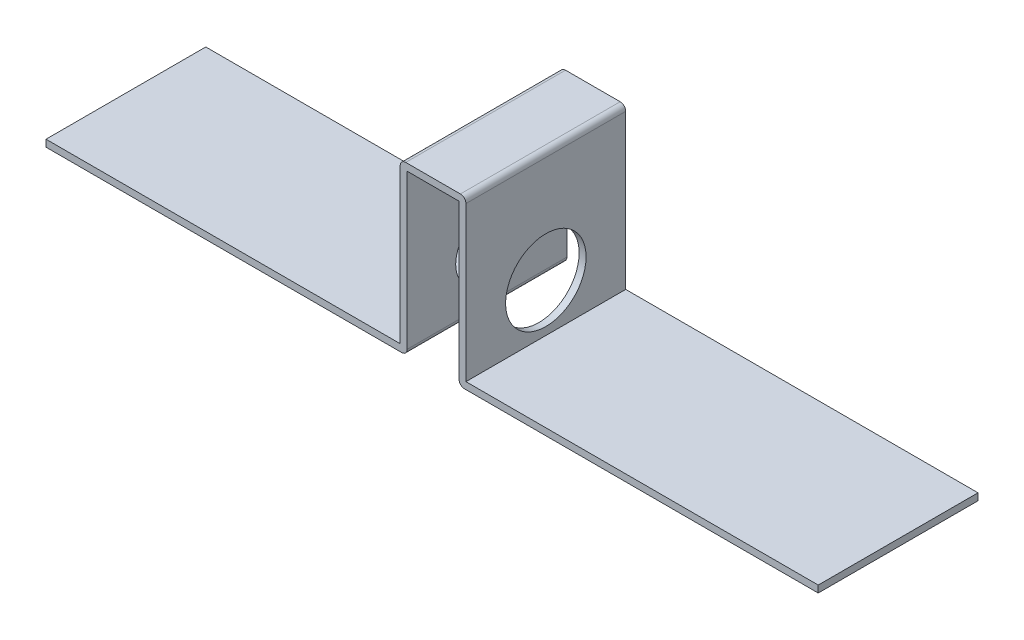
ISO-10303-21;
HEADER;
FILE_DESCRIPTION(('STEP AP214'),'2;1');
FILE_NAME('part.step','',(''),(''),'','','');
FILE_SCHEMA(('AUTOMOTIVE_DESIGN { 1 0 10303 214 1 1 1 1 }'));
ENDSEC;
DATA;
#1=APPLICATION_CONTEXT('core data for automotive mechanical design processes');
#2=APPLICATION_PROTOCOL_DEFINITION('international standard','automotive_design',2000,#1);
#3=PRODUCT_CONTEXT('',#1,'mechanical');
#4=PRODUCT('Part','Part','',(#3));
#5=PRODUCT_RELATED_PRODUCT_CATEGORY('part','',(#4));
#6=PRODUCT_DEFINITION_FORMATION('','',#4);
#7=PRODUCT_DEFINITION_CONTEXT('part definition',#1,'design');
#8=PRODUCT_DEFINITION('design','',#6,#7);
#9=PRODUCT_DEFINITION_SHAPE('','',#8);
#10=(LENGTH_UNIT() NAMED_UNIT(*) SI_UNIT(.MILLI.,.METRE.));
#11=(NAMED_UNIT(*) PLANE_ANGLE_UNIT() SI_UNIT($,.RADIAN.));
#12=(NAMED_UNIT(*) SI_UNIT($,.STERADIAN.) SOLID_ANGLE_UNIT());
#13=UNCERTAINTY_MEASURE_WITH_UNIT(LENGTH_MEASURE(1.E-05),#10,'distance_accuracy_value','');
#14=(GEOMETRIC_REPRESENTATION_CONTEXT(3) GLOBAL_UNCERTAINTY_ASSIGNED_CONTEXT((#13)) GLOBAL_UNIT_ASSIGNED_CONTEXT((#10,
#11,#12)) REPRESENTATION_CONTEXT('',''));
#15=CARTESIAN_POINT('',(0.,0.,0.));
#16=DIRECTION('',(0.,0.,1.));
#17=DIRECTION('',(1.,0.,0.));
#18=AXIS2_PLACEMENT_3D('',#15,#16,#17);
#19=CARTESIAN_POINT('',(0.,3.175,73.152));
#20=DIRECTION('',(1.,0.,0.));
#21=DIRECTION('',(0.,0.,-1.));
#22=AXIS2_PLACEMENT_3D('',#19,#20,#21);
#23=PLANE('',#22);
#24=DIRECTION('',(0.,-1.,0.));
#25=VECTOR('',#24,1.);
#26=CARTESIAN_POINT('',(0.,3.175,0.));
#27=LINE('',#26,#25);
#28=CARTESIAN_POINT('',(0.,3.175,0.));
#29=VERTEX_POINT('',#28);
#30=CARTESIAN_POINT('',(0.,0.,0.));
#31=VERTEX_POINT('',#30);
#32=EDGE_CURVE('E174',#29,#31,#27,.T.);
#33=ORIENTED_EDGE('',*,*,#32,.T.);
#34=DIRECTION('',(0.,0.,-1.));
#35=VECTOR('',#34,1.);
#36=CARTESIAN_POINT('',(0.,0.,73.152));
#37=LINE('',#36,#35);
#38=CARTESIAN_POINT('',(0.,0.,73.152));
#39=VERTEX_POINT('',#38);
#40=EDGE_CURVE('E155',#39,#31,#37,.T.);
#41=ORIENTED_EDGE('',*,*,#40,.F.);
#42=DIRECTION('',(0.,-1.,0.));
#43=VECTOR('',#42,1.);
#44=CARTESIAN_POINT('',(0.,3.175,73.152));
#45=LINE('',#44,#43);
#46=CARTESIAN_POINT('',(0.,3.175,73.152));
#47=VERTEX_POINT('',#46);
#48=EDGE_CURVE('E161',#47,#39,#45,.T.);
#49=ORIENTED_EDGE('',*,*,#48,.F.);
#50=DIRECTION('',(0.,0.,-1.));
#51=VECTOR('',#50,1.);
#52=CARTESIAN_POINT('',(0.,3.175,73.152));
#53=LINE('',#52,#51);
#54=EDGE_CURVE('E243',#47,#29,#53,.T.);
#55=ORIENTED_EDGE('',*,*,#54,.T.);
#56=EDGE_LOOP('',(#33,#41,#49,#55));
#57=FACE_BOUND('',#56,.T.);
#58=ADVANCED_FACE('F35',(#57),#23,.F.);
#59=CARTESIAN_POINT('',(0.,0.,73.152));
#60=DIRECTION('',(0.,1.,0.));
#61=DIRECTION('',(0.,0.,1.));
#62=AXIS2_PLACEMENT_3D('',#59,#60,#61);
#63=PLANE('',#62);
#64=DIRECTION('',(1.,0.,0.));
#65=VECTOR('',#64,1.);
#66=CARTESIAN_POINT('',(0.,0.,0.));
#67=LINE('',#66,#65);
#68=CARTESIAN_POINT('',(162.814,0.,0.));
#69=VERTEX_POINT('',#68);
#70=EDGE_CURVE('E309',#31,#69,#67,.T.);
#71=ORIENTED_EDGE('',*,*,#70,.T.);
#72=DIRECTION('',(0.,0.,-1.));
#73=VECTOR('',#72,1.);
#74=CARTESIAN_POINT('',(162.814,0.,73.152));
#75=LINE('',#74,#73);
#76=CARTESIAN_POINT('',(162.814,0.,73.152));
#77=VERTEX_POINT('',#76);
#78=EDGE_CURVE('E158',#69,#77,#75,.F.);
#79=ORIENTED_EDGE('',*,*,#78,.T.);
#80=DIRECTION('',(1.,0.,0.));
#81=VECTOR('',#80,1.);
#82=CARTESIAN_POINT('',(0.,0.,73.152));
#83=LINE('',#82,#81);
#84=EDGE_CURVE('E150',#39,#77,#83,.T.);
#85=ORIENTED_EDGE('',*,*,#84,.F.);
#86=ORIENTED_EDGE('',*,*,#40,.T.);
#87=EDGE_LOOP('',(#71,#79,#85,#86));
#88=FACE_BOUND('',#87,.T.);
#89=ADVANCED_FACE('F153',(#88),#63,.F.);
#90=CARTESIAN_POINT('',(165.354,0.,73.152));
#91=DIRECTION('',(-1.,0.,0.));
#92=DIRECTION('',(0.,0.,1.));
#93=AXIS2_PLACEMENT_3D('',#90,#91,#92);
#94=PLANE('',#93);
#95=CARTESIAN_POINT('',(165.354,25.146,36.576));
#96=DIRECTION('',(-1.,0.,0.));
#97=DIRECTION('',(0.,0.,1.));
#98=AXIS2_PLACEMENT_3D('',#95,#96,#97);
#99=CIRCLE('',#98,14.351);
#100=CARTESIAN_POINT('',(165.354,25.146,50.927));
#101=VERTEX_POINT('',#100);
#102=EDGE_CURVE('E310',#101,#101,#99,.T.);
#103=ORIENTED_EDGE('',*,*,#102,.T.);
#104=EDGE_LOOP('',(#103));
#105=FACE_BOUND('',#104,.T.);
#106=DIRECTION('',(0.,1.,0.));
#107=VECTOR('',#106,1.);
#108=CARTESIAN_POINT('',(165.354,0.,73.152));
#109=LINE('',#108,#107);
#110=CARTESIAN_POINT('',(165.354,2.54,73.152));
#111=VERTEX_POINT('',#110);
#112=CARTESIAN_POINT('',(165.354,73.152,73.152));
#113=VERTEX_POINT('',#112);
#114=EDGE_CURVE('E160',#111,#113,#109,.T.);
#115=ORIENTED_EDGE('',*,*,#114,.F.);
#116=DIRECTION('',(0.,0.,-1.));
#117=VECTOR('',#116,1.);
#118=CARTESIAN_POINT('',(165.354,2.54,73.152));
#119=LINE('',#118,#117);
#120=CARTESIAN_POINT('',(165.354,2.54,0.));
#121=VERTEX_POINT('',#120);
#122=EDGE_CURVE('E202',#111,#121,#119,.T.);
#123=ORIENTED_EDGE('',*,*,#122,.T.);
#124=DIRECTION('',(0.,1.,0.));
#125=VECTOR('',#124,1.);
#126=CARTESIAN_POINT('',(165.354,0.,0.));
#127=LINE('',#126,#125);
#128=CARTESIAN_POINT('',(165.354,73.152,0.));
#129=VERTEX_POINT('',#128);
#130=EDGE_CURVE('E274',#121,#129,#127,.T.);
#131=ORIENTED_EDGE('',*,*,#130,.T.);
#132=DIRECTION('',(0.,0.,-1.));
#133=VECTOR('',#132,1.);
#134=CARTESIAN_POINT('',(165.354,73.152,73.152));
#135=LINE('',#134,#133);
#136=EDGE_CURVE('E176',#113,#129,#135,.T.);
#137=ORIENTED_EDGE('',*,*,#136,.F.);
#138=EDGE_LOOP('',(#115,#123,#131,#137));
#139=FACE_BOUND('',#138,.T.);
#140=ADVANCED_FACE('F314',(#105,#139),#94,.F.);
#141=CARTESIAN_POINT('',(165.354,73.152,73.152));
#142=DIRECTION('',(0.,1.,0.));
#143=DIRECTION('',(0.,0.,1.));
#144=AXIS2_PLACEMENT_3D('',#141,#142,#143);
#145=PLANE('',#144);
#146=DIRECTION('',(1.,0.,0.));
#147=VECTOR('',#146,1.);
#148=CARTESIAN_POINT('',(165.354,73.152,0.));
#149=LINE('',#148,#147);
#150=CARTESIAN_POINT('',(189.103,73.152,0.));
#151=VERTEX_POINT('',#150);
#152=EDGE_CURVE('E269',#129,#151,#149,.T.);
#153=ORIENTED_EDGE('',*,*,#152,.T.);
#154=DIRECTION('',(0.,0.,-1.));
#155=VECTOR('',#154,1.);
#156=CARTESIAN_POINT('',(189.103,73.152,73.152));
#157=LINE('',#156,#155);
#158=CARTESIAN_POINT('',(189.103,73.152,73.152));
#159=VERTEX_POINT('',#158);
#160=EDGE_CURVE('E182',#159,#151,#157,.T.);
#161=ORIENTED_EDGE('',*,*,#160,.F.);
#162=DIRECTION('',(1.,0.,0.));
#163=VECTOR('',#162,1.);
#164=CARTESIAN_POINT('',(165.354,73.152,73.152));
#165=LINE('',#164,#163);
#166=EDGE_CURVE('E296',#113,#159,#165,.T.);
#167=ORIENTED_EDGE('',*,*,#166,.F.);
#168=ORIENTED_EDGE('',*,*,#136,.T.);
#169=EDGE_LOOP('',(#153,#161,#167,#168));
#170=FACE_BOUND('',#169,.T.);
#171=ADVANCED_FACE('F316',(#170),#145,.F.);
#172=CARTESIAN_POINT('',(189.103,73.152,73.152));
#173=DIRECTION('',(1.,0.,0.));
#174=DIRECTION('',(0.,1.,0.));
#175=AXIS2_PLACEMENT_3D('',#172,#173,#174);
#176=PLANE('',#175);
#177=CARTESIAN_POINT('',(189.103,25.146,36.576));
#178=DIRECTION('',(1.,0.,0.));
#179=DIRECTION('',(0.,1.,0.));
#180=AXIS2_PLACEMENT_3D('',#177,#178,#179);
#181=CIRCLE('',#180,18.415);
#182=CARTESIAN_POINT('',(189.103,43.561,36.576));
#183=VERTEX_POINT('',#182);
#184=EDGE_CURVE('E500',#183,#183,#181,.T.);
#185=ORIENTED_EDGE('',*,*,#184,.T.);
#186=EDGE_LOOP('',(#185));
#187=FACE_BOUND('',#186,.T.);
#188=DIRECTION('',(0.,-1.,0.));
#189=VECTOR('',#188,1.);
#190=CARTESIAN_POINT('',(189.103,73.152,0.));
#191=LINE('',#190,#189);
#192=CARTESIAN_POINT('',(189.103,2.54,0.));
#193=VERTEX_POINT('',#192);
#194=EDGE_CURVE('E262',#151,#193,#191,.T.);
#195=ORIENTED_EDGE('',*,*,#194,.T.);
#196=DIRECTION('',(0.,0.,-1.));
#197=VECTOR('',#196,1.);
#198=CARTESIAN_POINT('',(189.103,2.54,73.152));
#199=LINE('',#198,#197);
#200=CARTESIAN_POINT('',(189.103,2.54,73.152));
#201=VERTEX_POINT('',#200);
#202=EDGE_CURVE('E193',#193,#201,#199,.F.);
#203=ORIENTED_EDGE('',*,*,#202,.T.);
#204=DIRECTION('',(0.,-1.,0.));
#205=VECTOR('',#204,1.);
#206=CARTESIAN_POINT('',(189.103,73.152,73.152));
#207=LINE('',#206,#205);
#208=EDGE_CURVE('E264',#159,#201,#207,.T.);
#209=ORIENTED_EDGE('',*,*,#208,.F.);
#210=ORIENTED_EDGE('',*,*,#160,.T.);
#211=EDGE_LOOP('',(#195,#203,#209,#210));
#212=FACE_BOUND('',#211,.T.);
#213=ADVANCED_FACE('F261',(#187,#212),#176,.F.);
#214=CARTESIAN_POINT('',(189.103,0.,73.152));
#215=DIRECTION('',(0.,1.,0.));
#216=DIRECTION('',(-1.,0.,0.));
#217=AXIS2_PLACEMENT_3D('',#214,#215,#216);
#218=PLANE('',#217);
#219=DIRECTION('',(1.,0.,0.));
#220=VECTOR('',#219,1.);
#221=CARTESIAN_POINT('',(189.103,0.,73.152));
#222=LINE('',#221,#220);
#223=CARTESIAN_POINT('',(191.643,0.,73.152));
#224=VERTEX_POINT('',#223);
#225=CARTESIAN_POINT('',(353.568,0.,73.152));
#226=VERTEX_POINT('',#225);
#227=EDGE_CURVE('E291',#224,#226,#222,.T.);
#228=ORIENTED_EDGE('',*,*,#227,.F.);
#229=DIRECTION('',(0.,0.,-1.));
#230=VECTOR('',#229,1.);
#231=CARTESIAN_POINT('',(191.643,0.,73.152));
#232=LINE('',#231,#230);
#233=CARTESIAN_POINT('',(191.643,0.,0.));
#234=VERTEX_POINT('',#233);
#235=EDGE_CURVE('E175',#224,#234,#232,.T.);
#236=ORIENTED_EDGE('',*,*,#235,.T.);
#237=DIRECTION('',(1.,0.,0.));
#238=VECTOR('',#237,1.);
#239=CARTESIAN_POINT('',(189.103,0.,0.));
#240=LINE('',#239,#238);
#241=CARTESIAN_POINT('',(353.568,0.,0.));
#242=VERTEX_POINT('',#241);
#243=EDGE_CURVE('E270',#234,#242,#240,.T.);
#244=ORIENTED_EDGE('',*,*,#243,.T.);
#245=DIRECTION('',(0.,0.,-1.));
#246=VECTOR('',#245,1.);
#247=CARTESIAN_POINT('',(353.568,0.,73.152));
#248=LINE('',#247,#246);
#249=EDGE_CURVE('E253',#226,#242,#248,.T.);
#250=ORIENTED_EDGE('',*,*,#249,.F.);
#251=EDGE_LOOP('',(#228,#236,#244,#250));
#252=FACE_BOUND('',#251,.T.);
#253=ADVANCED_FACE('F290',(#252),#218,.F.);
#254=CARTESIAN_POINT('',(353.568,3.175,73.152));
#255=DIRECTION('',(-1.,0.,0.));
#256=DIRECTION('',(0.,0.,1.));
#257=AXIS2_PLACEMENT_3D('',#254,#255,#256);
#258=PLANE('',#257);
#259=DIRECTION('',(0.,1.,0.));
#260=VECTOR('',#259,1.);
#261=CARTESIAN_POINT('',(353.568,3.175,0.));
#262=LINE('',#261,#260);
#263=CARTESIAN_POINT('',(353.568,3.175,0.));
#264=VERTEX_POINT('',#263);
#265=EDGE_CURVE('E272',#242,#264,#262,.T.);
#266=ORIENTED_EDGE('',*,*,#265,.T.);
#267=DIRECTION('',(0.,0.,-1.));
#268=VECTOR('',#267,1.);
#269=CARTESIAN_POINT('',(353.568,3.175,73.152));
#270=LINE('',#269,#268);
#271=CARTESIAN_POINT('',(353.568,3.175,73.152));
#272=VERTEX_POINT('',#271);
#273=EDGE_CURVE('E250',#272,#264,#270,.T.);
#274=ORIENTED_EDGE('',*,*,#273,.F.);
#275=DIRECTION('',(0.,1.,0.));
#276=VECTOR('',#275,1.);
#277=CARTESIAN_POINT('',(353.568,3.175,73.152));
#278=LINE('',#277,#276);
#279=EDGE_CURVE('E287',#226,#272,#278,.T.);
#280=ORIENTED_EDGE('',*,*,#279,.F.);
#281=ORIENTED_EDGE('',*,*,#249,.T.);
#282=EDGE_LOOP('',(#266,#274,#280,#281));
#283=FACE_BOUND('',#282,.T.);
#284=ADVANCED_FACE('F284',(#283),#258,.F.);
#285=CARTESIAN_POINT('',(192.278,3.175,73.152));
#286=DIRECTION('',(0.,-1.,0.));
#287=DIRECTION('',(0.,0.,-1.));
#288=AXIS2_PLACEMENT_3D('',#285,#286,#287);
#289=PLANE('',#288);
#290=DIRECTION('',(-1.,0.,0.));
#291=VECTOR('',#290,1.);
#292=CARTESIAN_POINT('',(192.278,3.175,0.));
#293=LINE('',#292,#291);
#294=CARTESIAN_POINT('',(192.278,3.175,0.));
#295=VERTEX_POINT('',#294);
#296=EDGE_CURVE('E238',#264,#295,#293,.T.);
#297=ORIENTED_EDGE('',*,*,#296,.T.);
#298=DIRECTION('',(0.,0.,-1.));
#299=VECTOR('',#298,1.);
#300=CARTESIAN_POINT('',(192.278,3.175,73.152));
#301=LINE('',#300,#299);
#302=CARTESIAN_POINT('',(192.278,3.175,73.152));
#303=VERTEX_POINT('',#302);
#304=EDGE_CURVE('E248',#303,#295,#301,.T.);
#305=ORIENTED_EDGE('',*,*,#304,.F.);
#306=DIRECTION('',(-1.,0.,0.));
#307=VECTOR('',#306,1.);
#308=CARTESIAN_POINT('',(192.278,3.175,73.152));
#309=LINE('',#308,#307);
#310=EDGE_CURVE('E222',#272,#303,#309,.T.);
#311=ORIENTED_EDGE('',*,*,#310,.F.);
#312=ORIENTED_EDGE('',*,*,#273,.T.);
#313=EDGE_LOOP('',(#297,#305,#311,#312));
#314=FACE_BOUND('',#313,.T.);
#315=ADVANCED_FACE('F280',(#314),#289,.F.);
#316=CARTESIAN_POINT('',(192.278,76.327,73.152));
#317=DIRECTION('',(-1.,0.,0.));
#318=DIRECTION('',(0.,0.,1.));
#319=AXIS2_PLACEMENT_3D('',#316,#317,#318);
#320=PLANE('',#319);
#321=CARTESIAN_POINT('',(192.278,25.146,36.576));
#322=DIRECTION('',(1.,0.,0.));
#323=DIRECTION('',(0.,0.,-1.));
#324=AXIS2_PLACEMENT_3D('',#321,#322,#323);
#325=CIRCLE('',#324,18.415);
#326=CARTESIAN_POINT('',(192.278,25.146,18.161));
#327=VERTEX_POINT('',#326);
#328=EDGE_CURVE('E505',#327,#327,#325,.T.);
#329=ORIENTED_EDGE('',*,*,#328,.F.);
#330=EDGE_LOOP('',(#329));
#331=FACE_BOUND('',#330,.T.);
#332=DIRECTION('',(0.,1.,0.));
#333=VECTOR('',#332,1.);
#334=CARTESIAN_POINT('',(192.278,76.327,0.));
#335=LINE('',#334,#333);
#336=CARTESIAN_POINT('',(192.278,73.787,0.));
#337=VERTEX_POINT('',#336);
#338=EDGE_CURVE('E218',#295,#337,#335,.T.);
#339=ORIENTED_EDGE('',*,*,#338,.T.);
#340=DIRECTION('',(0.,0.,-1.));
#341=VECTOR('',#340,1.);
#342=CARTESIAN_POINT('',(192.278,73.787,73.152));
#343=LINE('',#342,#341);
#344=CARTESIAN_POINT('',(192.278,73.787,73.152));
#345=VERTEX_POINT('',#344);
#346=EDGE_CURVE('E43',#337,#345,#343,.F.);
#347=ORIENTED_EDGE('',*,*,#346,.T.);
#348=DIRECTION('',(0.,1.,0.));
#349=VECTOR('',#348,1.);
#350=CARTESIAN_POINT('',(192.278,76.327,73.152));
#351=LINE('',#350,#349);
#352=EDGE_CURVE('E216',#303,#345,#351,.T.);
#353=ORIENTED_EDGE('',*,*,#352,.F.);
#354=ORIENTED_EDGE('',*,*,#304,.T.);
#355=EDGE_LOOP('',(#339,#347,#353,#354));
#356=FACE_BOUND('',#355,.T.);
#357=ADVANCED_FACE('F214',(#331,#356),#320,.F.);
#358=CARTESIAN_POINT('',(162.179,76.327,73.152));
#359=DIRECTION('',(0.,-1.,0.));
#360=DIRECTION('',(0.,0.,-1.));
#361=AXIS2_PLACEMENT_3D('',#358,#359,#360);
#362=PLANE('',#361);
#363=DIRECTION('',(-1.,0.,0.));
#364=VECTOR('',#363,1.);
#365=CARTESIAN_POINT('',(162.179,76.327,73.152));
#366=LINE('',#365,#364);
#367=CARTESIAN_POINT('',(189.738,76.327,73.152));
#368=VERTEX_POINT('',#367);
#369=CARTESIAN_POINT('',(164.719,76.327,73.152));
#370=VERTEX_POINT('',#369);
#371=EDGE_CURVE('E224',#368,#370,#366,.T.);
#372=ORIENTED_EDGE('',*,*,#371,.F.);
#373=DIRECTION('',(0.,0.,-1.));
#374=VECTOR('',#373,1.);
#375=CARTESIAN_POINT('',(189.738,76.327,73.152));
#376=LINE('',#375,#374);
#377=CARTESIAN_POINT('',(189.738,76.327,0.));
#378=VERTEX_POINT('',#377);
#379=EDGE_CURVE('E207',#368,#378,#376,.T.);
#380=ORIENTED_EDGE('',*,*,#379,.T.);
#381=DIRECTION('',(-1.,0.,0.));
#382=VECTOR('',#381,1.);
#383=CARTESIAN_POINT('',(162.179,76.327,0.));
#384=LINE('',#383,#382);
#385=CARTESIAN_POINT('',(164.719,76.327,0.));
#386=VERTEX_POINT('',#385);
#387=EDGE_CURVE('E230',#378,#386,#384,.T.);
#388=ORIENTED_EDGE('',*,*,#387,.T.);
#389=DIRECTION('',(0.,0.,-1.));
#390=VECTOR('',#389,1.);
#391=CARTESIAN_POINT('',(164.719,76.327,73.152));
#392=LINE('',#391,#390);
#393=EDGE_CURVE('E58',#386,#370,#392,.F.);
#394=ORIENTED_EDGE('',*,*,#393,.T.);
#395=EDGE_LOOP('',(#372,#380,#388,#394));
#396=FACE_BOUND('',#395,.T.);
#397=ADVANCED_FACE('F229',(#396),#362,.F.);
#398=CARTESIAN_POINT('',(162.179,3.175,73.152));
#399=DIRECTION('',(1.,0.,0.));
#400=DIRECTION('',(0.,0.,-1.));
#401=AXIS2_PLACEMENT_3D('',#398,#399,#400);
#402=PLANE('',#401);
#403=CARTESIAN_POINT('',(162.179,25.146,36.576));
#404=DIRECTION('',(-1.,0.,0.));
#405=DIRECTION('',(0.,0.,1.));
#406=AXIS2_PLACEMENT_3D('',#403,#404,#405);
#407=CIRCLE('',#406,14.351);
#408=CARTESIAN_POINT('',(162.179,25.146,50.927));
#409=VERTEX_POINT('',#408);
#410=EDGE_CURVE('E496',#409,#409,#407,.T.);
#411=ORIENTED_EDGE('',*,*,#410,.F.);
#412=EDGE_LOOP('',(#411));
#413=FACE_BOUND('',#412,.T.);
#414=DIRECTION('',(0.,-1.,0.));
#415=VECTOR('',#414,1.);
#416=CARTESIAN_POINT('',(162.179,3.175,73.152));
#417=LINE('',#416,#415);
#418=CARTESIAN_POINT('',(162.179,73.787,73.152));
#419=VERTEX_POINT('',#418);
#420=CARTESIAN_POINT('',(162.179,3.175,73.152));
#421=VERTEX_POINT('',#420);
#422=EDGE_CURVE('E305',#419,#421,#417,.T.);
#423=ORIENTED_EDGE('',*,*,#422,.F.);
#424=DIRECTION('',(0.,0.,-1.));
#425=VECTOR('',#424,1.);
#426=CARTESIAN_POINT('',(162.179,73.787,73.152));
#427=LINE('',#426,#425);
#428=CARTESIAN_POINT('',(162.179,73.787,0.));
#429=VERTEX_POINT('',#428);
#430=EDGE_CURVE('E11',#419,#429,#427,.T.);
#431=ORIENTED_EDGE('',*,*,#430,.T.);
#432=DIRECTION('',(0.,-1.,0.));
#433=VECTOR('',#432,1.);
#434=CARTESIAN_POINT('',(162.179,3.175,0.));
#435=LINE('',#434,#433);
#436=CARTESIAN_POINT('',(162.179,3.175,0.));
#437=VERTEX_POINT('',#436);
#438=EDGE_CURVE('E235',#429,#437,#435,.T.);
#439=ORIENTED_EDGE('',*,*,#438,.T.);
#440=DIRECTION('',(0.,0.,-1.));
#441=VECTOR('',#440,1.);
#442=CARTESIAN_POINT('',(162.179,3.175,73.152));
#443=LINE('',#442,#441);
#444=EDGE_CURVE('E245',#421,#437,#443,.T.);
#445=ORIENTED_EDGE('',*,*,#444,.F.);
#446=EDGE_LOOP('',(#423,#431,#439,#445));
#447=FACE_BOUND('',#446,.T.);
#448=ADVANCED_FACE('F352',(#413,#447),#402,.F.);
#449=CARTESIAN_POINT('',(0.,3.175,73.152));
#450=DIRECTION('',(0.,-1.,0.));
#451=DIRECTION('',(0.,0.,-1.));
#452=AXIS2_PLACEMENT_3D('',#449,#450,#451);
#453=PLANE('',#452);
#454=DIRECTION('',(-1.,0.,0.));
#455=VECTOR('',#454,1.);
#456=CARTESIAN_POINT('',(0.,3.175,0.));
#457=LINE('',#456,#455);
#458=EDGE_CURVE('E171',#437,#29,#457,.T.);
#459=ORIENTED_EDGE('',*,*,#458,.T.);
#460=ORIENTED_EDGE('',*,*,#54,.F.);
#461=DIRECTION('',(-1.,0.,0.));
#462=VECTOR('',#461,1.);
#463=CARTESIAN_POINT('',(0.,3.175,73.152));
#464=LINE('',#463,#462);
#465=EDGE_CURVE('E167',#421,#47,#464,.T.);
#466=ORIENTED_EDGE('',*,*,#465,.F.);
#467=ORIENTED_EDGE('',*,*,#444,.T.);
#468=EDGE_LOOP('',(#459,#460,#466,#467));
#469=FACE_BOUND('',#468,.T.);
#470=ADVANCED_FACE('F356',(#469),#453,.F.);
#471=CARTESIAN_POINT('',(0.,0.,73.152));
#472=DIRECTION('',(0.,0.,1.));
#473=DIRECTION('',(1.,0.,0.));
#474=AXIS2_PLACEMENT_3D('',#471,#472,#473);
#475=PLANE('',#474);
#476=ORIENTED_EDGE('',*,*,#208,.T.);
#477=CARTESIAN_POINT('',(191.643,2.54,73.152));
#478=DIRECTION('',(0.,0.,1.));
#479=DIRECTION('',(1.,0.,0.));
#480=AXIS2_PLACEMENT_3D('',#477,#478,#479);
#481=CIRCLE('',#480,2.54);
#482=EDGE_CURVE('E200',#201,#224,#481,.T.);
#483=ORIENTED_EDGE('',*,*,#482,.T.);
#484=ORIENTED_EDGE('',*,*,#227,.T.);
#485=ORIENTED_EDGE('',*,*,#279,.T.);
#486=ORIENTED_EDGE('',*,*,#310,.T.);
#487=ORIENTED_EDGE('',*,*,#352,.T.);
#488=CARTESIAN_POINT('',(189.738,73.787,73.152));
#489=DIRECTION('',(0.,0.,1.));
#490=DIRECTION('',(1.,0.,0.));
#491=AXIS2_PLACEMENT_3D('',#488,#489,#490);
#492=CIRCLE('',#491,2.54);
#493=EDGE_CURVE('E196',#345,#368,#492,.T.);
#494=ORIENTED_EDGE('',*,*,#493,.T.);
#495=ORIENTED_EDGE('',*,*,#371,.T.);
#496=CARTESIAN_POINT('',(164.719,73.787,73.152));
#497=DIRECTION('',(0.,0.,1.));
#498=DIRECTION('',(1.,0.,0.));
#499=AXIS2_PLACEMENT_3D('',#496,#497,#498);
#500=CIRCLE('',#499,2.54);
#501=EDGE_CURVE('E50',#370,#419,#500,.T.);
#502=ORIENTED_EDGE('',*,*,#501,.T.);
#503=ORIENTED_EDGE('',*,*,#422,.T.);
#504=ORIENTED_EDGE('',*,*,#465,.T.);
#505=ORIENTED_EDGE('',*,*,#48,.T.);
#506=ORIENTED_EDGE('',*,*,#84,.T.);
#507=CARTESIAN_POINT('',(162.814,2.54,73.152));
#508=DIRECTION('',(0.,0.,1.));
#509=DIRECTION('',(1.,0.,0.));
#510=AXIS2_PLACEMENT_3D('',#507,#508,#509);
#511=CIRCLE('',#510,2.54);
#512=EDGE_CURVE('E198',#77,#111,#511,.T.);
#513=ORIENTED_EDGE('',*,*,#512,.T.);
#514=ORIENTED_EDGE('',*,*,#114,.T.);
#515=ORIENTED_EDGE('',*,*,#166,.T.);
#516=EDGE_LOOP('',(#476,#483,#484,#485,#486,#487,#494,#495,#502,#503,#504,#505,#506,#513,#514,#515));
#517=FACE_BOUND('',#516,.T.);
#518=ADVANCED_FACE('F165',(#517),#475,.T.);
#519=CARTESIAN_POINT('',(0.,0.,0.));
#520=DIRECTION('',(0.,0.,1.));
#521=DIRECTION('',(1.,0.,0.));
#522=AXIS2_PLACEMENT_3D('',#519,#520,#521);
#523=PLANE('',#522);
#524=ORIENTED_EDGE('',*,*,#243,.F.);
#525=CARTESIAN_POINT('',(191.643,2.54,0.));
#526=DIRECTION('',(0.,0.,1.));
#527=DIRECTION('',(1.,0.,0.));
#528=AXIS2_PLACEMENT_3D('',#525,#526,#527);
#529=CIRCLE('',#528,2.54);
#530=EDGE_CURVE('E191',#234,#193,#529,.F.);
#531=ORIENTED_EDGE('',*,*,#530,.T.);
#532=ORIENTED_EDGE('',*,*,#194,.F.);
#533=ORIENTED_EDGE('',*,*,#152,.F.);
#534=ORIENTED_EDGE('',*,*,#130,.F.);
#535=CARTESIAN_POINT('',(162.814,2.54,0.));
#536=DIRECTION('',(0.,0.,1.));
#537=DIRECTION('',(1.,0.,0.));
#538=AXIS2_PLACEMENT_3D('',#535,#536,#537);
#539=CIRCLE('',#538,2.54);
#540=EDGE_CURVE('E189',#121,#69,#539,.F.);
#541=ORIENTED_EDGE('',*,*,#540,.T.);
#542=ORIENTED_EDGE('',*,*,#70,.F.);
#543=ORIENTED_EDGE('',*,*,#32,.F.);
#544=ORIENTED_EDGE('',*,*,#458,.F.);
#545=ORIENTED_EDGE('',*,*,#438,.F.);
#546=CARTESIAN_POINT('',(164.719,73.787,0.));
#547=DIRECTION('',(0.,0.,1.));
#548=DIRECTION('',(1.,0.,0.));
#549=AXIS2_PLACEMENT_3D('',#546,#547,#548);
#550=CIRCLE('',#549,2.54);
#551=EDGE_CURVE('E179',#429,#386,#550,.F.);
#552=ORIENTED_EDGE('',*,*,#551,.T.);
#553=ORIENTED_EDGE('',*,*,#387,.F.);
#554=CARTESIAN_POINT('',(189.738,73.787,0.));
#555=DIRECTION('',(0.,0.,1.));
#556=DIRECTION('',(1.,0.,0.));
#557=AXIS2_PLACEMENT_3D('',#554,#555,#556);
#558=CIRCLE('',#557,2.54);
#559=EDGE_CURVE('E187',#378,#337,#558,.F.);
#560=ORIENTED_EDGE('',*,*,#559,.T.);
#561=ORIENTED_EDGE('',*,*,#338,.F.);
#562=ORIENTED_EDGE('',*,*,#296,.F.);
#563=ORIENTED_EDGE('',*,*,#265,.F.);
#564=EDGE_LOOP('',(#524,#531,#532,#533,#534,#541,#542,#543,#544,#545,#552,#553,#560,#561,#562,#563));
#565=FACE_BOUND('',#564,.T.);
#566=ADVANCED_FACE('F233',(#565),#523,.F.);
#567=CARTESIAN_POINT('',(174.879,25.146,36.576));
#568=DIRECTION('',(-1.,0.,0.));
#569=DIRECTION('',(0.,0.,1.));
#570=AXIS2_PLACEMENT_3D('',#567,#568,#569);
#571=CYLINDRICAL_SURFACE('',#570,14.351);
#572=ORIENTED_EDGE('',*,*,#410,.T.);
#573=EDGE_LOOP('',(#572));
#574=FACE_BOUND('',#573,.T.);
#575=ORIENTED_EDGE('',*,*,#102,.F.);
#576=EDGE_LOOP('',(#575));
#577=FACE_BOUND('',#576,.T.);
#578=ADVANCED_FACE('F403',(#574,#577),#571,.F.);
#579=CARTESIAN_POINT('',(179.578,25.146,36.576));
#580=DIRECTION('',(1.,0.,0.));
#581=DIRECTION('',(0.,0.,-1.));
#582=AXIS2_PLACEMENT_3D('',#579,#580,#581);
#583=CYLINDRICAL_SURFACE('',#582,18.415);
#584=ORIENTED_EDGE('',*,*,#328,.T.);
#585=EDGE_LOOP('',(#584));
#586=FACE_BOUND('',#585,.T.);
#587=ORIENTED_EDGE('',*,*,#184,.F.);
#588=EDGE_LOOP('',(#587));
#589=FACE_BOUND('',#588,.T.);
#590=ADVANCED_FACE('F340',(#586,#589),#583,.F.);
#591=CARTESIAN_POINT('',(191.643,2.54,73.152));
#592=DIRECTION('',(0.,0.,-1.));
#593=DIRECTION('',(-1.,0.,0.));
#594=AXIS2_PLACEMENT_3D('',#591,#592,#593);
#595=CYLINDRICAL_SURFACE('',#594,2.54);
#596=ORIENTED_EDGE('',*,*,#482,.F.);
#597=ORIENTED_EDGE('',*,*,#202,.F.);
#598=ORIENTED_EDGE('',*,*,#530,.F.);
#599=ORIENTED_EDGE('',*,*,#235,.F.);
#600=EDGE_LOOP('',(#596,#597,#598,#599));
#601=FACE_BOUND('',#600,.T.);
#602=ADVANCED_FACE('F295',(#601),#595,.T.);
#603=CARTESIAN_POINT('',(162.814,2.54,73.152));
#604=DIRECTION('',(0.,0.,-1.));
#605=DIRECTION('',(-1.,0.,0.));
#606=AXIS2_PLACEMENT_3D('',#603,#604,#605);
#607=CYLINDRICAL_SURFACE('',#606,2.54);
#608=ORIENTED_EDGE('',*,*,#512,.F.);
#609=ORIENTED_EDGE('',*,*,#78,.F.);
#610=ORIENTED_EDGE('',*,*,#540,.F.);
#611=ORIENTED_EDGE('',*,*,#122,.F.);
#612=EDGE_LOOP('',(#608,#609,#610,#611));
#613=FACE_BOUND('',#612,.T.);
#614=ADVANCED_FACE('F339',(#613),#607,.T.);
#615=CARTESIAN_POINT('',(189.738,73.787,73.152));
#616=DIRECTION('',(0.,0.,-1.));
#617=DIRECTION('',(-1.,0.,0.));
#618=AXIS2_PLACEMENT_3D('',#615,#616,#617);
#619=CYLINDRICAL_SURFACE('',#618,2.54);
#620=ORIENTED_EDGE('',*,*,#493,.F.);
#621=ORIENTED_EDGE('',*,*,#346,.F.);
#622=ORIENTED_EDGE('',*,*,#559,.F.);
#623=ORIENTED_EDGE('',*,*,#379,.F.);
#624=EDGE_LOOP('',(#620,#621,#622,#623));
#625=FACE_BOUND('',#624,.T.);
#626=ADVANCED_FACE('F227',(#625),#619,.T.);
#627=CARTESIAN_POINT('',(164.719,73.787,73.152));
#628=DIRECTION('',(0.,0.,-1.));
#629=DIRECTION('',(-1.,0.,0.));
#630=AXIS2_PLACEMENT_3D('',#627,#628,#629);
#631=CYLINDRICAL_SURFACE('',#630,2.54);
#632=ORIENTED_EDGE('',*,*,#501,.F.);
#633=ORIENTED_EDGE('',*,*,#393,.F.);
#634=ORIENTED_EDGE('',*,*,#551,.F.);
#635=ORIENTED_EDGE('',*,*,#430,.F.);
#636=EDGE_LOOP('',(#632,#633,#634,#635));
#637=FACE_BOUND('',#636,.T.);
#638=ADVANCED_FACE('F37',(#637),#631,.T.);
#639=CLOSED_SHELL('',(#58,#89,#140,#171,#213,#253,#284,#315,#357,#397,#448,#470,#518,#566,#578,
#590,#602,#614,#626,#638));
#640=MANIFOLD_SOLID_BREP('B2',#639);
#641=ADVANCED_BREP_SHAPE_REPRESENTATION('',(#18,#640),#14);
#642=SHAPE_DEFINITION_REPRESENTATION(#9,#641);
ENDSEC;
END-ISO-10303-21;
